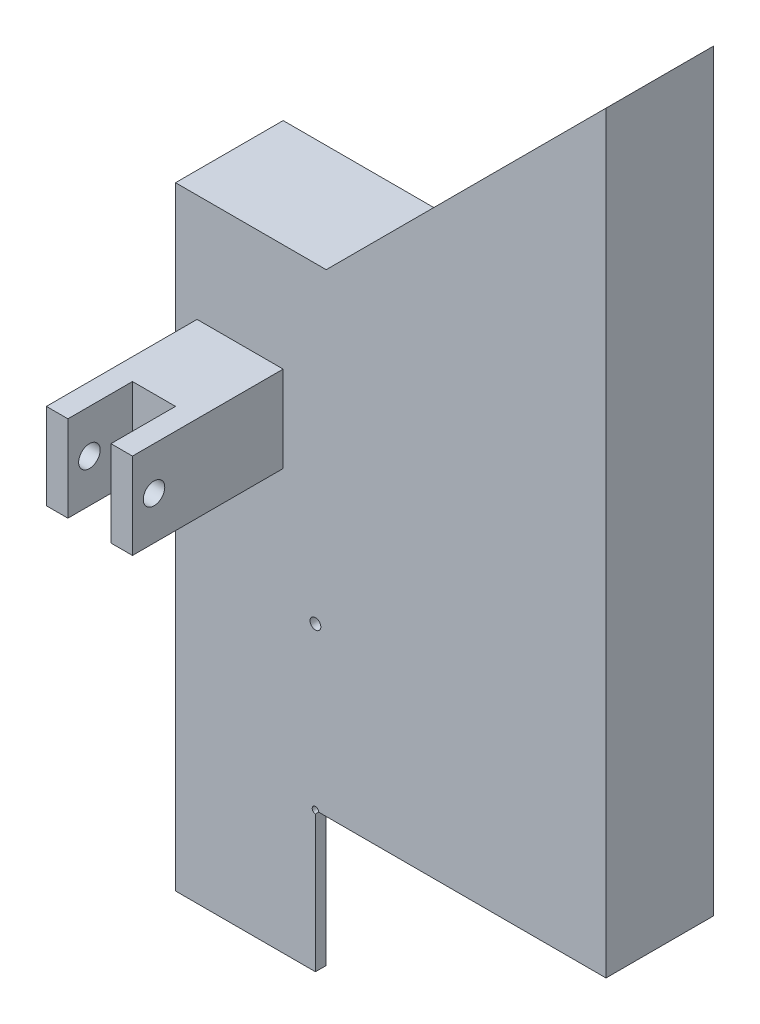
ISO-10303-21;
HEADER;
FILE_DESCRIPTION(('STEP AP214'),'2;1');
FILE_NAME('part.step','',(''),(''),'','','');
FILE_SCHEMA(('AUTOMOTIVE_DESIGN { 1 0 10303 214 1 1 1 1 }'));
ENDSEC;
DATA;
#1=APPLICATION_CONTEXT('core data for automotive mechanical design processes');
#2=APPLICATION_PROTOCOL_DEFINITION('international standard','automotive_design',2000,#1);
#3=PRODUCT_CONTEXT('',#1,'mechanical');
#4=PRODUCT('Part','Part','',(#3));
#5=PRODUCT_RELATED_PRODUCT_CATEGORY('part','',(#4));
#6=PRODUCT_DEFINITION_FORMATION('','',#4);
#7=PRODUCT_DEFINITION_CONTEXT('part definition',#1,'design');
#8=PRODUCT_DEFINITION('design','',#6,#7);
#9=PRODUCT_DEFINITION_SHAPE('','',#8);
#10=(LENGTH_UNIT() NAMED_UNIT(*) SI_UNIT(.MILLI.,.METRE.));
#11=(NAMED_UNIT(*) PLANE_ANGLE_UNIT() SI_UNIT($,.RADIAN.));
#12=(NAMED_UNIT(*) SI_UNIT($,.STERADIAN.) SOLID_ANGLE_UNIT());
#13=UNCERTAINTY_MEASURE_WITH_UNIT(LENGTH_MEASURE(1.E-05),#10,'distance_accuracy_value','');
#14=(GEOMETRIC_REPRESENTATION_CONTEXT(3) GLOBAL_UNCERTAINTY_ASSIGNED_CONTEXT((#13)) GLOBAL_UNIT_ASSIGNED_CONTEXT((#10,
#11,#12)) REPRESENTATION_CONTEXT('',''));
#15=CARTESIAN_POINT('',(0.,0.,0.));
#16=DIRECTION('',(0.,0.,1.));
#17=DIRECTION('',(1.,0.,0.));
#18=AXIS2_PLACEMENT_3D('',#15,#16,#17);
#19=CARTESIAN_POINT('',(0.,0.,50.));
#20=DIRECTION('',(0.,1.,0.));
#21=DIRECTION('',(0.,0.,1.));
#22=AXIS2_PLACEMENT_3D('',#19,#20,#21);
#23=PLANE('',#22);
#24=DIRECTION('',(1.,0.,0.));
#25=VECTOR('',#24,1.);
#26=CARTESIAN_POINT('',(0.,0.,0.));
#27=LINE('',#26,#25);
#28=CARTESIAN_POINT('',(0.,0.,0.));
#29=VERTEX_POINT('',#28);
#30=CARTESIAN_POINT('',(63.5,0.,0.));
#31=VERTEX_POINT('',#30);
#32=EDGE_CURVE('E203',#29,#31,#27,.T.);
#33=ORIENTED_EDGE('',*,*,#32,.T.);
#34=DIRECTION('',(0.,0.,1.));
#35=VECTOR('',#34,1.);
#36=CARTESIAN_POINT('',(63.5,0.,0.));
#37=LINE('',#36,#35);
#38=CARTESIAN_POINT('',(63.5,0.,45.));
#39=VERTEX_POINT('',#38);
#40=EDGE_CURVE('E169',#31,#39,#37,.T.);
#41=ORIENTED_EDGE('',*,*,#40,.T.);
#42=DIRECTION('',(1.,0.,0.));
#43=VECTOR('',#42,1.);
#44=CARTESIAN_POINT('',(0.,0.,45.));
#45=LINE('',#44,#43);
#46=CARTESIAN_POINT('',(0.,0.,45.));
#47=VERTEX_POINT('',#46);
#48=EDGE_CURVE('E308',#47,#39,#45,.T.);
#49=ORIENTED_EDGE('',*,*,#48,.F.);
#50=DIRECTION('',(0.,0.,-1.));
#51=VECTOR('',#50,1.);
#52=CARTESIAN_POINT('',(0.,0.,50.));
#53=LINE('',#52,#51);
#54=EDGE_CURVE('E47',#47,#29,#53,.T.);
#55=ORIENTED_EDGE('',*,*,#54,.T.);
#56=EDGE_LOOP('',(#33,#41,#49,#55));
#57=FACE_BOUND('',#56,.T.);
#58=ADVANCED_FACE('F39',(#57),#23,.F.);
#59=CARTESIAN_POINT('',(0.,0.,90.));
#60=DIRECTION('',(0.,0.,1.));
#61=DIRECTION('',(1.,0.,0.));
#62=AXIS2_PLACEMENT_3D('',#59,#60,#61);
#63=PLANE('',#62);
#64=DIRECTION('',(1.,0.,0.));
#65=VECTOR('',#64,1.);
#66=CARTESIAN_POINT('',(10.,130.,90.));
#67=LINE('',#66,#65);
#68=CARTESIAN_POINT('',(20.,130.,90.));
#69=VERTEX_POINT('',#68);
#70=CARTESIAN_POINT('',(40.,130.,90.));
#71=VERTEX_POINT('',#70);
#72=EDGE_CURVE('E279',#69,#71,#67,.T.);
#73=ORIENTED_EDGE('',*,*,#72,.T.);
#74=DIRECTION('',(0.,-1.,0.));
#75=VECTOR('',#74,1.);
#76=CARTESIAN_POINT('',(40.,170.,90.));
#77=LINE('',#76,#75);
#78=CARTESIAN_POINT('',(40.,170.,90.));
#79=VERTEX_POINT('',#78);
#80=EDGE_CURVE('E61',#79,#71,#77,.T.);
#81=ORIENTED_EDGE('',*,*,#80,.F.);
#82=DIRECTION('',(-1.,0.,0.));
#83=VECTOR('',#82,1.);
#84=CARTESIAN_POINT('',(10.,170.,90.));
#85=LINE('',#84,#83);
#86=CARTESIAN_POINT('',(20.,170.,90.));
#87=VERTEX_POINT('',#86);
#88=EDGE_CURVE('E281',#79,#87,#85,.T.);
#89=ORIENTED_EDGE('',*,*,#88,.T.);
#90=DIRECTION('',(0.,1.,0.));
#91=VECTOR('',#90,1.);
#92=CARTESIAN_POINT('',(20.,170.,90.));
#93=LINE('',#92,#91);
#94=EDGE_CURVE('E250',#69,#87,#93,.T.);
#95=ORIENTED_EDGE('',*,*,#94,.F.);
#96=EDGE_LOOP('',(#73,#81,#89,#95));
#97=FACE_BOUND('',#96,.T.);
#98=ADVANCED_FACE('F364',(#97),#63,.T.);
#99=CARTESIAN_POINT('',(0.,0.,50.));
#100=DIRECTION('',(0.,0.,1.));
#101=DIRECTION('',(1.,0.,0.));
#102=AXIS2_PLACEMENT_3D('',#99,#100,#101);
#103=PLANE('',#102);
#104=CARTESIAN_POINT('',(65.,0.,50.));
#105=DIRECTION('',(0.,0.,1.));
#106=DIRECTION('',(1.,0.,0.));
#107=AXIS2_PLACEMENT_3D('',#104,#105,#106);
#108=CIRCLE('',#107,1.5);
#109=CARTESIAN_POINT('',(66.5,0.,50.));
#110=VERTEX_POINT('',#109);
#111=CARTESIAN_POINT('',(65.,-1.5,50.));
#112=VERTEX_POINT('',#111);
#113=EDGE_CURVE('E54',#110,#112,#108,.T.);
#114=ORIENTED_EDGE('',*,*,#113,.F.);
#115=DIRECTION('',(1.,0.,0.));
#116=VECTOR('',#115,1.);
#117=CARTESIAN_POINT('',(0.,0.,50.));
#118=LINE('',#117,#116);
#119=CARTESIAN_POINT('',(200.,0.,50.));
#120=VERTEX_POINT('',#119);
#121=EDGE_CURVE('E175',#110,#120,#118,.T.);
#122=ORIENTED_EDGE('',*,*,#121,.T.);
#123=DIRECTION('',(0.,1.,0.));
#124=VECTOR('',#123,1.);
#125=CARTESIAN_POINT('',(200.,0.,50.));
#126=LINE('',#125,#124);
#127=CARTESIAN_POINT('',(200.,350.,50.));
#128=VERTEX_POINT('',#127);
#129=EDGE_CURVE('E184',#120,#128,#126,.T.);
#130=ORIENTED_EDGE('',*,*,#129,.T.);
#131=DIRECTION('',(-0.707106781186548,-0.707106781186547,0.));
#132=VECTOR('',#131,1.);
#133=CARTESIAN_POINT('',(200.,350.,50.));
#134=LINE('',#133,#132);
#135=CARTESIAN_POINT('',(70.,220.,50.));
#136=VERTEX_POINT('',#135);
#137=EDGE_CURVE('E187',#128,#136,#134,.T.);
#138=ORIENTED_EDGE('',*,*,#137,.T.);
#139=DIRECTION('',(-1.,0.,0.));
#140=VECTOR('',#139,1.);
#141=CARTESIAN_POINT('',(70.,220.,50.));
#142=LINE('',#141,#140);
#143=CARTESIAN_POINT('',(0.,220.,50.));
#144=VERTEX_POINT('',#143);
#145=EDGE_CURVE('E195',#136,#144,#142,.T.);
#146=ORIENTED_EDGE('',*,*,#145,.T.);
#147=DIRECTION('',(0.,-1.,0.));
#148=VECTOR('',#147,1.);
#149=CARTESIAN_POINT('',(0.,220.,50.));
#150=LINE('',#149,#148);
#151=CARTESIAN_POINT('',(0.,-65.,50.));
#152=VERTEX_POINT('',#151);
#153=EDGE_CURVE('E185',#144,#152,#150,.T.);
#154=ORIENTED_EDGE('',*,*,#153,.T.);
#155=DIRECTION('',(-1.,0.,0.));
#156=VECTOR('',#155,1.);
#157=CARTESIAN_POINT('',(0.,-65.,50.));
#158=LINE('',#157,#156);
#159=CARTESIAN_POINT('',(65.,-65.,50.));
#160=VERTEX_POINT('',#159);
#161=EDGE_CURVE('E315',#160,#152,#158,.T.);
#162=ORIENTED_EDGE('',*,*,#161,.F.);
#163=DIRECTION('',(0.,-1.,0.));
#164=VECTOR('',#163,1.);
#165=CARTESIAN_POINT('',(65.,-65.,50.));
#166=LINE('',#165,#164);
#167=EDGE_CURVE('E178',#112,#160,#166,.T.);
#168=ORIENTED_EDGE('',*,*,#167,.F.);
#169=EDGE_LOOP('',(#114,#122,#130,#138,#146,#154,#162,#168));
#170=FACE_BOUND('',#169,.T.);
#171=CARTESIAN_POINT('',(65.,75.,50.));
#172=DIRECTION('',(0.,0.,1.));
#173=DIRECTION('',(1.,0.,0.));
#174=AXIS2_PLACEMENT_3D('',#171,#172,#173);
#175=CIRCLE('',#174,2.5);
#176=CARTESIAN_POINT('',(67.5,75.,50.));
#177=VERTEX_POINT('',#176);
#178=EDGE_CURVE('E168',#177,#177,#175,.T.);
#179=ORIENTED_EDGE('',*,*,#178,.F.);
#180=EDGE_LOOP('',(#179));
#181=FACE_BOUND('',#180,.T.);
#182=DIRECTION('',(1.,0.,0.));
#183=VECTOR('',#182,1.);
#184=CARTESIAN_POINT('',(10.,130.,50.));
#185=LINE('',#184,#183);
#186=CARTESIAN_POINT('',(10.,130.,50.));
#187=VERTEX_POINT('',#186);
#188=CARTESIAN_POINT('',(50.,130.,50.));
#189=VERTEX_POINT('',#188);
#190=EDGE_CURVE('E287',#187,#189,#185,.T.);
#191=ORIENTED_EDGE('',*,*,#190,.F.);
#192=DIRECTION('',(0.,-1.,0.));
#193=VECTOR('',#192,1.);
#194=CARTESIAN_POINT('',(10.,170.,50.));
#195=LINE('',#194,#193);
#196=CARTESIAN_POINT('',(10.,170.,50.));
#197=VERTEX_POINT('',#196);
#198=EDGE_CURVE('E278',#197,#187,#195,.T.);
#199=ORIENTED_EDGE('',*,*,#198,.F.);
#200=DIRECTION('',(-1.,0.,0.));
#201=VECTOR('',#200,1.);
#202=CARTESIAN_POINT('',(10.,170.,50.));
#203=LINE('',#202,#201);
#204=CARTESIAN_POINT('',(50.,170.,50.));
#205=VERTEX_POINT('',#204);
#206=EDGE_CURVE('E282',#205,#197,#203,.T.);
#207=ORIENTED_EDGE('',*,*,#206,.F.);
#208=DIRECTION('',(0.,1.,0.));
#209=VECTOR('',#208,1.);
#210=CARTESIAN_POINT('',(50.,170.,50.));
#211=LINE('',#210,#209);
#212=EDGE_CURVE('E289',#189,#205,#211,.T.);
#213=ORIENTED_EDGE('',*,*,#212,.F.);
#214=EDGE_LOOP('',(#191,#199,#207,#213));
#215=FACE_BOUND('',#214,.T.);
#216=ADVANCED_FACE('F173',(#170,#181,#215),#103,.T.);
#217=ORIENTED_EDGE('',*,*,#121,.F.);
#218=DIRECTION('',(0.,0.,1.));
#219=VECTOR('',#218,1.);
#220=CARTESIAN_POINT('',(66.5,0.,0.));
#221=LINE('',#220,#219);
#222=CARTESIAN_POINT('',(66.5,0.,0.));
#223=VERTEX_POINT('',#222);
#224=EDGE_CURVE('E161',#110,#223,#221,.F.);
#225=ORIENTED_EDGE('',*,*,#224,.T.);
#226=CARTESIAN_POINT('',(200.,0.,0.));
#227=VERTEX_POINT('',#226);
#228=EDGE_CURVE('E201',#223,#227,#27,.T.);
#229=ORIENTED_EDGE('',*,*,#228,.T.);
#230=DIRECTION('',(0.,0.,-1.));
#231=VECTOR('',#230,1.);
#232=CARTESIAN_POINT('',(200.,0.,50.));
#233=LINE('',#232,#231);
#234=EDGE_CURVE('E182',#120,#227,#233,.T.);
#235=ORIENTED_EDGE('',*,*,#234,.F.);
#236=EDGE_LOOP('',(#217,#225,#229,#235));
#237=FACE_BOUND('',#236,.T.);
#238=ADVANCED_FACE('F180',(#237),#23,.F.);
#239=CARTESIAN_POINT('',(0.,220.,50.));
#240=DIRECTION('',(1.,0.,0.));
#241=DIRECTION('',(0.,1.,0.));
#242=AXIS2_PLACEMENT_3D('',#239,#240,#241);
#243=PLANE('',#242);
#244=DIRECTION('',(0.,-1.,0.));
#245=VECTOR('',#244,1.);
#246=CARTESIAN_POINT('',(0.,220.,0.));
#247=LINE('',#246,#245);
#248=CARTESIAN_POINT('',(0.,220.,0.));
#249=VERTEX_POINT('',#248);
#250=EDGE_CURVE('E198',#249,#29,#247,.T.);
#251=ORIENTED_EDGE('',*,*,#250,.T.);
#252=ORIENTED_EDGE('',*,*,#54,.F.);
#253=DIRECTION('',(0.,1.,0.));
#254=VECTOR('',#253,1.);
#255=CARTESIAN_POINT('',(0.,-65.,45.));
#256=LINE('',#255,#254);
#257=CARTESIAN_POINT('',(0.,-65.,45.));
#258=VERTEX_POINT('',#257);
#259=EDGE_CURVE('E202',#258,#47,#256,.T.);
#260=ORIENTED_EDGE('',*,*,#259,.F.);
#261=DIRECTION('',(0.,0.,-1.));
#262=VECTOR('',#261,1.);
#263=CARTESIAN_POINT('',(0.,-65.,50.));
#264=LINE('',#263,#262);
#265=EDGE_CURVE('E309',#152,#258,#264,.T.);
#266=ORIENTED_EDGE('',*,*,#265,.F.);
#267=ORIENTED_EDGE('',*,*,#153,.F.);
#268=DIRECTION('',(0.,0.,-1.));
#269=VECTOR('',#268,1.);
#270=CARTESIAN_POINT('',(0.,220.,50.));
#271=LINE('',#270,#269);
#272=EDGE_CURVE('E197',#144,#249,#271,.T.);
#273=ORIENTED_EDGE('',*,*,#272,.T.);
#274=EDGE_LOOP('',(#251,#252,#260,#266,#267,#273));
#275=FACE_BOUND('',#274,.T.);
#276=ADVANCED_FACE('F41',(#275),#243,.F.);
#277=CARTESIAN_POINT('',(200.,0.,50.));
#278=DIRECTION('',(-1.,0.,0.));
#279=DIRECTION('',(0.,0.,1.));
#280=AXIS2_PLACEMENT_3D('',#277,#278,#279);
#281=PLANE('',#280);
#282=DIRECTION('',(0.,1.,0.));
#283=VECTOR('',#282,1.);
#284=CARTESIAN_POINT('',(200.,0.,0.));
#285=LINE('',#284,#283);
#286=CARTESIAN_POINT('',(200.,350.,0.));
#287=VERTEX_POINT('',#286);
#288=EDGE_CURVE('E206',#227,#287,#285,.T.);
#289=ORIENTED_EDGE('',*,*,#288,.T.);
#290=DIRECTION('',(0.,0.,-1.));
#291=VECTOR('',#290,1.);
#292=CARTESIAN_POINT('',(200.,350.,50.));
#293=LINE('',#292,#291);
#294=EDGE_CURVE('E216',#128,#287,#293,.T.);
#295=ORIENTED_EDGE('',*,*,#294,.F.);
#296=ORIENTED_EDGE('',*,*,#129,.F.);
#297=ORIENTED_EDGE('',*,*,#234,.T.);
#298=EDGE_LOOP('',(#289,#295,#296,#297));
#299=FACE_BOUND('',#298,.T.);
#300=ADVANCED_FACE('F355',(#299),#281,.F.);
#301=CARTESIAN_POINT('',(200.,350.,50.));
#302=DIRECTION('',(0.707106781186547,-0.707106781186548,0.));
#303=DIRECTION('',(0.707106781186548,0.707106781186547,0.));
#304=AXIS2_PLACEMENT_3D('',#301,#302,#303);
#305=PLANE('',#304);
#306=DIRECTION('',(-0.707106781186548,-0.707106781186547,0.));
#307=VECTOR('',#306,1.);
#308=CARTESIAN_POINT('',(200.,350.,0.));
#309=LINE('',#308,#307);
#310=CARTESIAN_POINT('',(70.,220.,0.));
#311=VERTEX_POINT('',#310);
#312=EDGE_CURVE('E208',#287,#311,#309,.T.);
#313=ORIENTED_EDGE('',*,*,#312,.T.);
#314=DIRECTION('',(0.,0.,-1.));
#315=VECTOR('',#314,1.);
#316=CARTESIAN_POINT('',(70.,220.,50.));
#317=LINE('',#316,#315);
#318=EDGE_CURVE('E213',#136,#311,#317,.T.);
#319=ORIENTED_EDGE('',*,*,#318,.F.);
#320=ORIENTED_EDGE('',*,*,#137,.F.);
#321=ORIENTED_EDGE('',*,*,#294,.T.);
#322=EDGE_LOOP('',(#313,#319,#320,#321));
#323=FACE_BOUND('',#322,.T.);
#324=ADVANCED_FACE('F351',(#323),#305,.F.);
#325=CARTESIAN_POINT('',(70.,220.,50.));
#326=DIRECTION('',(0.,-1.,0.));
#327=DIRECTION('',(0.,0.,-1.));
#328=AXIS2_PLACEMENT_3D('',#325,#326,#327);
#329=PLANE('',#328);
#330=DIRECTION('',(-1.,0.,0.));
#331=VECTOR('',#330,1.);
#332=CARTESIAN_POINT('',(70.,220.,0.));
#333=LINE('',#332,#331);
#334=EDGE_CURVE('E190',#311,#249,#333,.T.);
#335=ORIENTED_EDGE('',*,*,#334,.T.);
#336=ORIENTED_EDGE('',*,*,#272,.F.);
#337=ORIENTED_EDGE('',*,*,#145,.F.);
#338=ORIENTED_EDGE('',*,*,#318,.T.);
#339=EDGE_LOOP('',(#335,#336,#337,#338));
#340=FACE_BOUND('',#339,.T.);
#341=ADVANCED_FACE('F347',(#340),#329,.F.);
#342=CARTESIAN_POINT('',(0.,0.,0.));
#343=DIRECTION('',(0.,0.,1.));
#344=DIRECTION('',(1.,0.,0.));
#345=AXIS2_PLACEMENT_3D('',#342,#343,#344);
#346=PLANE('',#345);
#347=CARTESIAN_POINT('',(65.,75.,0.));
#348=DIRECTION('',(0.,0.,1.));
#349=DIRECTION('',(1.,0.,0.));
#350=AXIS2_PLACEMENT_3D('',#347,#348,#349);
#351=CIRCLE('',#350,2.5);
#352=CARTESIAN_POINT('',(67.5,75.,0.));
#353=VERTEX_POINT('',#352);
#354=EDGE_CURVE('E225',#353,#353,#351,.T.);
#355=ORIENTED_EDGE('',*,*,#354,.T.);
#356=EDGE_LOOP('',(#355));
#357=FACE_BOUND('',#356,.T.);
#358=ORIENTED_EDGE('',*,*,#228,.F.);
#359=CARTESIAN_POINT('',(65.,0.,0.));
#360=DIRECTION('',(0.,0.,1.));
#361=DIRECTION('',(1.,0.,0.));
#362=AXIS2_PLACEMENT_3D('',#359,#360,#361);
#363=CIRCLE('',#362,1.5);
#364=EDGE_CURVE('E164',#223,#31,#363,.T.);
#365=ORIENTED_EDGE('',*,*,#364,.T.);
#366=ORIENTED_EDGE('',*,*,#32,.F.);
#367=ORIENTED_EDGE('',*,*,#250,.F.);
#368=ORIENTED_EDGE('',*,*,#334,.F.);
#369=ORIENTED_EDGE('',*,*,#312,.F.);
#370=ORIENTED_EDGE('',*,*,#288,.F.);
#371=EDGE_LOOP('',(#358,#365,#366,#367,#368,#369,#370));
#372=FACE_BOUND('',#371,.T.);
#373=ADVANCED_FACE('F332',(#357,#372),#346,.F.);
#374=CARTESIAN_POINT('',(0.,-65.,45.));
#375=DIRECTION('',(0.,0.,1.));
#376=DIRECTION('',(1.,0.,0.));
#377=AXIS2_PLACEMENT_3D('',#374,#375,#376);
#378=PLANE('',#377);
#379=ORIENTED_EDGE('',*,*,#48,.T.);
#380=CARTESIAN_POINT('',(65.,0.,45.));
#381=DIRECTION('',(0.,0.,1.));
#382=DIRECTION('',(1.,0.,0.));
#383=AXIS2_PLACEMENT_3D('',#380,#381,#382);
#384=CIRCLE('',#383,1.5);
#385=CARTESIAN_POINT('',(65.,-1.5,45.));
#386=VERTEX_POINT('',#385);
#387=EDGE_CURVE('E335',#39,#386,#384,.T.);
#388=ORIENTED_EDGE('',*,*,#387,.T.);
#389=DIRECTION('',(0.,-1.,0.));
#390=VECTOR('',#389,1.);
#391=CARTESIAN_POINT('',(65.,-65.,45.));
#392=LINE('',#391,#390);
#393=CARTESIAN_POINT('',(65.,-65.,45.));
#394=VERTEX_POINT('',#393);
#395=EDGE_CURVE('E302',#386,#394,#392,.T.);
#396=ORIENTED_EDGE('',*,*,#395,.T.);
#397=DIRECTION('',(1.,0.,0.));
#398=VECTOR('',#397,1.);
#399=CARTESIAN_POINT('',(0.,-65.,45.));
#400=LINE('',#399,#398);
#401=EDGE_CURVE('E312',#258,#394,#400,.T.);
#402=ORIENTED_EDGE('',*,*,#401,.F.);
#403=ORIENTED_EDGE('',*,*,#259,.T.);
#404=EDGE_LOOP('',(#379,#388,#396,#402,#403));
#405=FACE_BOUND('',#404,.T.);
#406=ADVANCED_FACE('F321',(#405),#378,.F.);
#407=CARTESIAN_POINT('',(0.,-65.,0.));
#408=DIRECTION('',(0.,-1.,0.));
#409=DIRECTION('',(0.,0.,-1.));
#410=AXIS2_PLACEMENT_3D('',#407,#408,#409);
#411=PLANE('',#410);
#412=DIRECTION('',(0.,0.,1.));
#413=VECTOR('',#412,1.);
#414=CARTESIAN_POINT('',(65.,-65.,45.));
#415=LINE('',#414,#413);
#416=EDGE_CURVE('E304',#394,#160,#415,.T.);
#417=ORIENTED_EDGE('',*,*,#416,.T.);
#418=ORIENTED_EDGE('',*,*,#161,.T.);
#419=ORIENTED_EDGE('',*,*,#265,.T.);
#420=ORIENTED_EDGE('',*,*,#401,.T.);
#421=EDGE_LOOP('',(#417,#418,#419,#420));
#422=FACE_BOUND('',#421,.T.);
#423=ADVANCED_FACE('F343',(#422),#411,.T.);
#424=CARTESIAN_POINT('',(65.,-65.,45.));
#425=DIRECTION('',(-1.,0.,0.));
#426=DIRECTION('',(0.,0.,1.));
#427=AXIS2_PLACEMENT_3D('',#424,#425,#426);
#428=PLANE('',#427);
#429=ORIENTED_EDGE('',*,*,#395,.F.);
#430=DIRECTION('',(0.,0.,1.));
#431=VECTOR('',#430,1.);
#432=CARTESIAN_POINT('',(65.,-1.5,0.));
#433=LINE('',#432,#431);
#434=EDGE_CURVE('E11',#386,#112,#433,.T.);
#435=ORIENTED_EDGE('',*,*,#434,.T.);
#436=ORIENTED_EDGE('',*,*,#167,.T.);
#437=ORIENTED_EDGE('',*,*,#416,.F.);
#438=EDGE_LOOP('',(#429,#435,#436,#437));
#439=FACE_BOUND('',#438,.T.);
#440=ADVANCED_FACE('F341',(#439),#428,.F.);
#441=CARTESIAN_POINT('',(10.,170.,90.));
#442=DIRECTION('',(1.,0.,0.));
#443=DIRECTION('',(0.,1.,0.));
#444=AXIS2_PLACEMENT_3D('',#441,#442,#443);
#445=PLANE('',#444);
#446=CARTESIAN_POINT('',(10.,150.,110.));
#447=DIRECTION('',(1.,0.,0.));
#448=DIRECTION('',(0.,1.,0.));
#449=AXIS2_PLACEMENT_3D('',#446,#447,#448);
#450=CIRCLE('',#449,5.00000000000001);
#451=CARTESIAN_POINT('',(10.,155.,110.));
#452=VERTEX_POINT('',#451);
#453=EDGE_CURVE('E224',#452,#452,#450,.T.);
#454=ORIENTED_EDGE('',*,*,#453,.T.);
#455=EDGE_LOOP('',(#454));
#456=FACE_BOUND('',#455,.T.);
#457=ORIENTED_EDGE('',*,*,#198,.T.);
#458=DIRECTION('',(0.,0.,-1.));
#459=VECTOR('',#458,1.);
#460=CARTESIAN_POINT('',(10.,130.,90.));
#461=LINE('',#460,#459);
#462=CARTESIAN_POINT('',(10.,130.,120.));
#463=VERTEX_POINT('',#462);
#464=EDGE_CURVE('E300',#463,#187,#461,.T.);
#465=ORIENTED_EDGE('',*,*,#464,.F.);
#466=DIRECTION('',(0.,-1.,0.));
#467=VECTOR('',#466,1.);
#468=CARTESIAN_POINT('',(10.,170.,120.));
#469=LINE('',#468,#467);
#470=CARTESIAN_POINT('',(10.,170.,120.));
#471=VERTEX_POINT('',#470);
#472=EDGE_CURVE('E260',#471,#463,#469,.T.);
#473=ORIENTED_EDGE('',*,*,#472,.F.);
#474=DIRECTION('',(0.,0.,-1.));
#475=VECTOR('',#474,1.);
#476=CARTESIAN_POINT('',(10.,170.,90.));
#477=LINE('',#476,#475);
#478=EDGE_CURVE('E284',#471,#197,#477,.T.);
#479=ORIENTED_EDGE('',*,*,#478,.T.);
#480=EDGE_LOOP('',(#457,#465,#473,#479));
#481=FACE_BOUND('',#480,.T.);
#482=ADVANCED_FACE('F416',(#456,#481),#445,.F.);
#483=CARTESIAN_POINT('',(10.,130.,90.));
#484=DIRECTION('',(0.,1.,0.));
#485=DIRECTION('',(0.,0.,1.));
#486=AXIS2_PLACEMENT_3D('',#483,#484,#485);
#487=PLANE('',#486);
#488=ORIENTED_EDGE('',*,*,#190,.T.);
#489=DIRECTION('',(0.,0.,-1.));
#490=VECTOR('',#489,1.);
#491=CARTESIAN_POINT('',(50.,130.,90.));
#492=LINE('',#491,#490);
#493=CARTESIAN_POINT('',(50.,130.,120.));
#494=VERTEX_POINT('',#493);
#495=EDGE_CURVE('E297',#494,#189,#492,.T.);
#496=ORIENTED_EDGE('',*,*,#495,.F.);
#497=DIRECTION('',(1.,0.,0.));
#498=VECTOR('',#497,1.);
#499=CARTESIAN_POINT('',(50.,130.,120.));
#500=LINE('',#499,#498);
#501=CARTESIAN_POINT('',(40.,130.,120.));
#502=VERTEX_POINT('',#501);
#503=EDGE_CURVE('E248',#502,#494,#500,.T.);
#504=ORIENTED_EDGE('',*,*,#503,.F.);
#505=DIRECTION('',(0.,0.,-1.));
#506=VECTOR('',#505,1.);
#507=CARTESIAN_POINT('',(40.,130.,120.));
#508=LINE('',#507,#506);
#509=EDGE_CURVE('E245',#502,#71,#508,.T.);
#510=ORIENTED_EDGE('',*,*,#509,.T.);
#511=ORIENTED_EDGE('',*,*,#72,.F.);
#512=DIRECTION('',(0.,0.,-1.));
#513=VECTOR('',#512,1.);
#514=CARTESIAN_POINT('',(20.,130.,120.));
#515=LINE('',#514,#513);
#516=CARTESIAN_POINT('',(20.,130.,120.));
#517=VERTEX_POINT('',#516);
#518=EDGE_CURVE('E275',#517,#69,#515,.T.);
#519=ORIENTED_EDGE('',*,*,#518,.F.);
#520=DIRECTION('',(1.,0.,0.));
#521=VECTOR('',#520,1.);
#522=CARTESIAN_POINT('',(10.,130.,120.));
#523=LINE('',#522,#521);
#524=EDGE_CURVE('E263',#463,#517,#523,.T.);
#525=ORIENTED_EDGE('',*,*,#524,.F.);
#526=ORIENTED_EDGE('',*,*,#464,.T.);
#527=EDGE_LOOP('',(#488,#496,#504,#510,#511,#519,#525,#526));
#528=FACE_BOUND('',#527,.T.);
#529=ADVANCED_FACE('F411',(#528),#487,.F.);
#530=CARTESIAN_POINT('',(50.,170.,90.));
#531=DIRECTION('',(-1.,0.,0.));
#532=DIRECTION('',(0.,-1.,0.));
#533=AXIS2_PLACEMENT_3D('',#530,#531,#532);
#534=PLANE('',#533);
#535=CARTESIAN_POINT('',(50.,150.,110.));
#536=DIRECTION('',(1.,0.,0.));
#537=DIRECTION('',(0.,1.,0.));
#538=AXIS2_PLACEMENT_3D('',#535,#536,#537);
#539=CIRCLE('',#538,5.00000000000001);
#540=CARTESIAN_POINT('',(50.,155.,110.));
#541=VERTEX_POINT('',#540);
#542=EDGE_CURVE('E227',#541,#541,#539,.T.);
#543=ORIENTED_EDGE('',*,*,#542,.F.);
#544=EDGE_LOOP('',(#543));
#545=FACE_BOUND('',#544,.T.);
#546=ORIENTED_EDGE('',*,*,#212,.T.);
#547=DIRECTION('',(0.,0.,-1.));
#548=VECTOR('',#547,1.);
#549=CARTESIAN_POINT('',(50.,170.,90.));
#550=LINE('',#549,#548);
#551=CARTESIAN_POINT('',(50.,170.,120.));
#552=VERTEX_POINT('',#551);
#553=EDGE_CURVE('E295',#552,#205,#550,.T.);
#554=ORIENTED_EDGE('',*,*,#553,.F.);
#555=DIRECTION('',(0.,1.,0.));
#556=VECTOR('',#555,1.);
#557=CARTESIAN_POINT('',(50.,170.,120.));
#558=LINE('',#557,#556);
#559=EDGE_CURVE('E251',#494,#552,#558,.T.);
#560=ORIENTED_EDGE('',*,*,#559,.F.);
#561=ORIENTED_EDGE('',*,*,#495,.T.);
#562=EDGE_LOOP('',(#546,#554,#560,#561));
#563=FACE_BOUND('',#562,.T.);
#564=ADVANCED_FACE('F415',(#545,#563),#534,.F.);
#565=CARTESIAN_POINT('',(10.,170.,90.));
#566=DIRECTION('',(0.,-1.,0.));
#567=DIRECTION('',(0.,0.,-1.));
#568=AXIS2_PLACEMENT_3D('',#565,#566,#567);
#569=PLANE('',#568);
#570=ORIENTED_EDGE('',*,*,#206,.T.);
#571=ORIENTED_EDGE('',*,*,#478,.F.);
#572=DIRECTION('',(-1.,0.,0.));
#573=VECTOR('',#572,1.);
#574=CARTESIAN_POINT('',(10.,170.,120.));
#575=LINE('',#574,#573);
#576=CARTESIAN_POINT('',(20.,170.,120.));
#577=VERTEX_POINT('',#576);
#578=EDGE_CURVE('E267',#577,#471,#575,.T.);
#579=ORIENTED_EDGE('',*,*,#578,.F.);
#580=DIRECTION('',(0.,0.,-1.));
#581=VECTOR('',#580,1.);
#582=CARTESIAN_POINT('',(20.,170.,120.));
#583=LINE('',#582,#581);
#584=EDGE_CURVE('E270',#577,#87,#583,.T.);
#585=ORIENTED_EDGE('',*,*,#584,.T.);
#586=ORIENTED_EDGE('',*,*,#88,.F.);
#587=DIRECTION('',(0.,0.,-1.));
#588=VECTOR('',#587,1.);
#589=CARTESIAN_POINT('',(40.,170.,120.));
#590=LINE('',#589,#588);
#591=CARTESIAN_POINT('',(40.,170.,120.));
#592=VERTEX_POINT('',#591);
#593=EDGE_CURVE('E242',#592,#79,#590,.T.);
#594=ORIENTED_EDGE('',*,*,#593,.F.);
#595=DIRECTION('',(-1.,0.,0.));
#596=VECTOR('',#595,1.);
#597=CARTESIAN_POINT('',(50.,170.,120.));
#598=LINE('',#597,#596);
#599=EDGE_CURVE('E256',#552,#592,#598,.T.);
#600=ORIENTED_EDGE('',*,*,#599,.F.);
#601=ORIENTED_EDGE('',*,*,#553,.T.);
#602=EDGE_LOOP('',(#570,#571,#579,#585,#586,#594,#600,#601));
#603=FACE_BOUND('',#602,.T.);
#604=ADVANCED_FACE('F423',(#603),#569,.F.);
#605=CARTESIAN_POINT('',(20.,170.,120.));
#606=DIRECTION('',(-1.,0.,0.));
#607=DIRECTION('',(0.,-1.,0.));
#608=AXIS2_PLACEMENT_3D('',#605,#606,#607);
#609=PLANE('',#608);
#610=CARTESIAN_POINT('',(20.,150.,110.));
#611=DIRECTION('',(-1.,0.,0.));
#612=DIRECTION('',(0.,-1.,0.));
#613=AXIS2_PLACEMENT_3D('',#610,#611,#612);
#614=CIRCLE('',#613,5.00000000000001);
#615=CARTESIAN_POINT('',(20.,145.,110.));
#616=VERTEX_POINT('',#615);
#617=EDGE_CURVE('E223',#616,#616,#614,.T.);
#618=ORIENTED_EDGE('',*,*,#617,.T.);
#619=EDGE_LOOP('',(#618));
#620=FACE_BOUND('',#619,.T.);
#621=ORIENTED_EDGE('',*,*,#94,.T.);
#622=ORIENTED_EDGE('',*,*,#584,.F.);
#623=DIRECTION('',(0.,1.,0.));
#624=VECTOR('',#623,1.);
#625=CARTESIAN_POINT('',(20.,170.,120.));
#626=LINE('',#625,#624);
#627=EDGE_CURVE('E265',#517,#577,#626,.T.);
#628=ORIENTED_EDGE('',*,*,#627,.F.);
#629=ORIENTED_EDGE('',*,*,#518,.T.);
#630=EDGE_LOOP('',(#621,#622,#628,#629));
#631=FACE_BOUND('',#630,.T.);
#632=ADVANCED_FACE('F427',(#620,#631),#609,.F.);
#633=CARTESIAN_POINT('',(0.,0.,120.));
#634=DIRECTION('',(0.,0.,1.));
#635=DIRECTION('',(1.,0.,0.));
#636=AXIS2_PLACEMENT_3D('',#633,#634,#635);
#637=PLANE('',#636);
#638=ORIENTED_EDGE('',*,*,#472,.T.);
#639=ORIENTED_EDGE('',*,*,#524,.T.);
#640=ORIENTED_EDGE('',*,*,#627,.T.);
#641=ORIENTED_EDGE('',*,*,#578,.T.);
#642=EDGE_LOOP('',(#638,#639,#640,#641));
#643=FACE_BOUND('',#642,.T.);
#644=ADVANCED_FACE('F434',(#643),#637,.T.);
#645=CARTESIAN_POINT('',(40.,170.,120.));
#646=DIRECTION('',(1.,0.,0.));
#647=DIRECTION('',(0.,1.,0.));
#648=AXIS2_PLACEMENT_3D('',#645,#646,#647);
#649=PLANE('',#648);
#650=CARTESIAN_POINT('',(40.,150.,110.));
#651=DIRECTION('',(1.,0.,0.));
#652=DIRECTION('',(0.,1.,0.));
#653=AXIS2_PLACEMENT_3D('',#650,#651,#652);
#654=CIRCLE('',#653,5.00000000000001);
#655=CARTESIAN_POINT('',(40.,155.,110.));
#656=VERTEX_POINT('',#655);
#657=EDGE_CURVE('E221',#656,#656,#654,.T.);
#658=ORIENTED_EDGE('',*,*,#657,.T.);
#659=EDGE_LOOP('',(#658));
#660=FACE_BOUND('',#659,.T.);
#661=ORIENTED_EDGE('',*,*,#80,.T.);
#662=ORIENTED_EDGE('',*,*,#509,.F.);
#663=DIRECTION('',(0.,-1.,0.));
#664=VECTOR('',#663,1.);
#665=CARTESIAN_POINT('',(40.,170.,120.));
#666=LINE('',#665,#664);
#667=EDGE_CURVE('E254',#592,#502,#666,.T.);
#668=ORIENTED_EDGE('',*,*,#667,.F.);
#669=ORIENTED_EDGE('',*,*,#593,.T.);
#670=EDGE_LOOP('',(#661,#662,#668,#669));
#671=FACE_BOUND('',#670,.T.);
#672=ADVANCED_FACE('F438',(#660,#671),#649,.F.);
#673=CARTESIAN_POINT('',(0.,0.,120.));
#674=DIRECTION('',(0.,0.,-1.));
#675=DIRECTION('',(-1.,0.,0.));
#676=AXIS2_PLACEMENT_3D('',#673,#674,#675);
#677=PLANE('',#676);
#678=ORIENTED_EDGE('',*,*,#559,.T.);
#679=ORIENTED_EDGE('',*,*,#599,.T.);
#680=ORIENTED_EDGE('',*,*,#667,.T.);
#681=ORIENTED_EDGE('',*,*,#503,.T.);
#682=EDGE_LOOP('',(#678,#679,#680,#681));
#683=FACE_BOUND('',#682,.T.);
#684=ADVANCED_FACE('F445',(#683),#677,.F.);
#685=CARTESIAN_POINT('',(10.,150.,110.));
#686=DIRECTION('',(1.,0.,0.));
#687=DIRECTION('',(0.,1.,0.));
#688=AXIS2_PLACEMENT_3D('',#685,#686,#687);
#689=CYLINDRICAL_SURFACE('',#688,5.00000000000001);
#690=ORIENTED_EDGE('',*,*,#542,.T.);
#691=EDGE_LOOP('',(#690));
#692=FACE_BOUND('',#691,.T.);
#693=ORIENTED_EDGE('',*,*,#657,.F.);
#694=EDGE_LOOP('',(#693));
#695=FACE_BOUND('',#694,.T.);
#696=ADVANCED_FACE('F449',(#692,#695),#689,.F.);
#697=ORIENTED_EDGE('',*,*,#453,.F.);
#698=EDGE_LOOP('',(#697));
#699=FACE_BOUND('',#698,.T.);
#700=ORIENTED_EDGE('',*,*,#617,.F.);
#701=EDGE_LOOP('',(#700));
#702=FACE_BOUND('',#701,.T.);
#703=ADVANCED_FACE('F486',(#699,#702),#689,.F.);
#704=CARTESIAN_POINT('',(65.,75.,-5.));
#705=DIRECTION('',(0.,0.,1.));
#706=DIRECTION('',(1.,0.,0.));
#707=AXIS2_PLACEMENT_3D('',#704,#705,#706);
#708=CYLINDRICAL_SURFACE('',#707,2.5);
#709=ORIENTED_EDGE('',*,*,#178,.T.);
#710=EDGE_LOOP('',(#709));
#711=FACE_BOUND('',#710,.T.);
#712=ORIENTED_EDGE('',*,*,#354,.F.);
#713=EDGE_LOOP('',(#712));
#714=FACE_BOUND('',#713,.T.);
#715=ADVANCED_FACE('F494',(#711,#714),#708,.F.);
#716=CARTESIAN_POINT('',(65.,0.,0.));
#717=DIRECTION('',(0.,0.,1.));
#718=DIRECTION('',(1.,0.,0.));
#719=AXIS2_PLACEMENT_3D('',#716,#717,#718);
#720=CYLINDRICAL_SURFACE('',#719,1.5);
#721=ORIENTED_EDGE('',*,*,#113,.T.);
#722=ORIENTED_EDGE('',*,*,#434,.F.);
#723=ORIENTED_EDGE('',*,*,#387,.F.);
#724=ORIENTED_EDGE('',*,*,#40,.F.);
#725=ORIENTED_EDGE('',*,*,#364,.F.);
#726=ORIENTED_EDGE('',*,*,#224,.F.);
#727=EDGE_LOOP('',(#721,#722,#723,#724,#725,#726));
#728=FACE_BOUND('',#727,.T.);
#729=ADVANCED_FACE('F162',(#728),#720,.F.);
#730=CLOSED_SHELL('',(#58,#98,#216,#238,#276,#300,#324,#341,#373,#406,#423,#440,#482,#529,#564,
#604,#632,#644,#672,#684,#696,#703,#715,#729));
#731=MANIFOLD_SOLID_BREP('B2',#730);
#732=ADVANCED_BREP_SHAPE_REPRESENTATION('',(#18,#731),#14);
#733=SHAPE_DEFINITION_REPRESENTATION(#9,#732);
ENDSEC;
END-ISO-10303-21;
